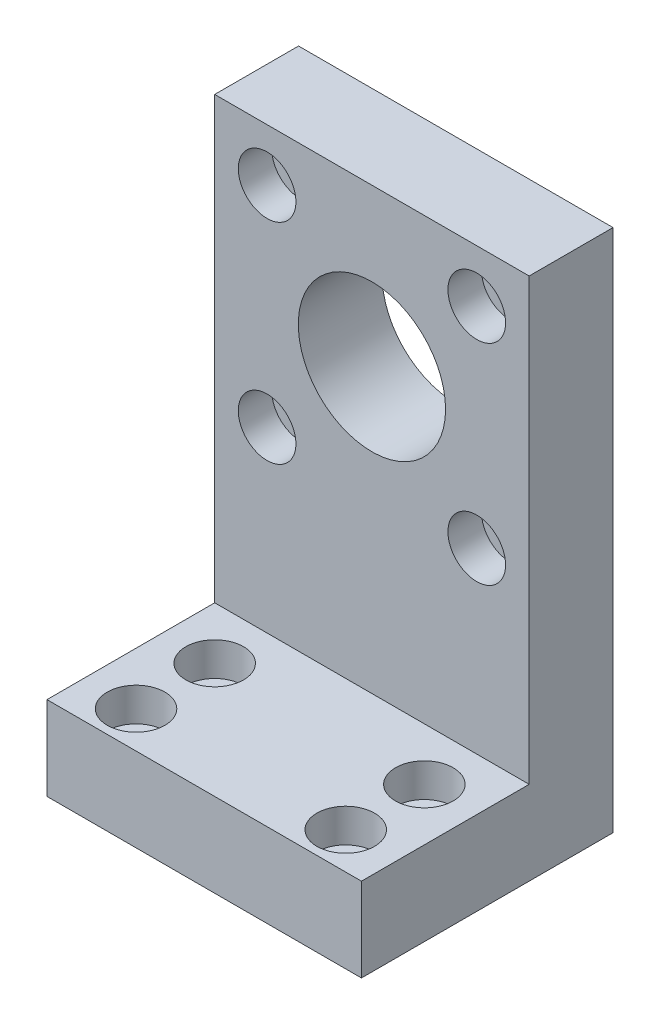
ISO-10303-21;
HEADER;
FILE_DESCRIPTION(('STEP AP214'),'2;1');
FILE_NAME('part.step','',(''),(''),'','','');
FILE_SCHEMA(('AUTOMOTIVE_DESIGN { 1 0 10303 214 1 1 1 1 }'));
ENDSEC;
DATA;
#1=APPLICATION_CONTEXT('core data for automotive mechanical design processes');
#2=APPLICATION_PROTOCOL_DEFINITION('international standard','automotive_design',2000,#1);
#3=PRODUCT_CONTEXT('',#1,'mechanical');
#4=PRODUCT('Part','Part','',(#3));
#5=PRODUCT_RELATED_PRODUCT_CATEGORY('part','',(#4));
#6=PRODUCT_DEFINITION_FORMATION('','',#4);
#7=PRODUCT_DEFINITION_CONTEXT('part definition',#1,'design');
#8=PRODUCT_DEFINITION('design','',#6,#7);
#9=PRODUCT_DEFINITION_SHAPE('','',#8);
#10=(LENGTH_UNIT() NAMED_UNIT(*) SI_UNIT(.MILLI.,.METRE.));
#11=(NAMED_UNIT(*) PLANE_ANGLE_UNIT() SI_UNIT($,.RADIAN.));
#12=(NAMED_UNIT(*) SI_UNIT($,.STERADIAN.) SOLID_ANGLE_UNIT());
#13=UNCERTAINTY_MEASURE_WITH_UNIT(LENGTH_MEASURE(1.E-05),#10,'distance_accuracy_value','');
#14=(GEOMETRIC_REPRESENTATION_CONTEXT(3) GLOBAL_UNCERTAINTY_ASSIGNED_CONTEXT((#13)) GLOBAL_UNIT_ASSIGNED_CONTEXT((#10,
#11,#12)) REPRESENTATION_CONTEXT('',''));
#15=CARTESIAN_POINT('',(0.,0.,0.));
#16=DIRECTION('',(0.,0.,1.));
#17=DIRECTION('',(1.,0.,0.));
#18=AXIS2_PLACEMENT_3D('',#15,#16,#17);
#19=CARTESIAN_POINT('',(0.,0.,8.));
#20=DIRECTION('',(0.,0.,-1.));
#21=DIRECTION('',(-1.,0.,0.));
#22=AXIS2_PLACEMENT_3D('',#19,#20,#21);
#23=PLANE('',#22);
#24=CARTESIAN_POINT('',(-20.,0.,8.));
#25=DIRECTION('',(0.,0.,1.));
#26=DIRECTION('',(1.,0.,0.));
#27=AXIS2_PLACEMENT_3D('',#24,#25,#26);
#28=CIRCLE('',#27,5.5);
#29=CARTESIAN_POINT('',(-14.5,0.,8.));
#30=VERTEX_POINT('',#29);
#31=EDGE_CURVE('E143',#30,#30,#28,.T.);
#32=ORIENTED_EDGE('',*,*,#31,.F.);
#33=EDGE_LOOP('',(#32));
#34=FACE_BOUND('',#33,.T.);
#35=CARTESIAN_POINT('',(20.,0.,8.));
#36=DIRECTION('',(0.,0.,1.));
#37=DIRECTION('',(1.,0.,0.));
#38=AXIS2_PLACEMENT_3D('',#35,#36,#37);
#39=CIRCLE('',#38,5.5);
#40=CARTESIAN_POINT('',(25.5,0.,8.));
#41=VERTEX_POINT('',#40);
#42=EDGE_CURVE('E159',#41,#41,#39,.T.);
#43=ORIENTED_EDGE('',*,*,#42,.F.);
#44=EDGE_LOOP('',(#43));
#45=FACE_BOUND('',#44,.T.);
#46=CARTESIAN_POINT('',(20.,40.,8.));
#47=DIRECTION('',(0.,0.,1.));
#48=DIRECTION('',(1.,0.,0.));
#49=AXIS2_PLACEMENT_3D('',#46,#47,#48);
#50=CIRCLE('',#49,5.5);
#51=CARTESIAN_POINT('',(25.5,40.,8.));
#52=VERTEX_POINT('',#51);
#53=EDGE_CURVE('E175',#52,#52,#50,.T.);
#54=ORIENTED_EDGE('',*,*,#53,.F.);
#55=EDGE_LOOP('',(#54));
#56=FACE_BOUND('',#55,.T.);
#57=CARTESIAN_POINT('',(-20.,40.,8.));
#58=DIRECTION('',(0.,0.,1.));
#59=DIRECTION('',(1.,0.,0.));
#60=AXIS2_PLACEMENT_3D('',#57,#58,#59);
#61=CIRCLE('',#60,5.5);
#62=CARTESIAN_POINT('',(-14.5,40.,8.));
#63=VERTEX_POINT('',#62);
#64=EDGE_CURVE('E191',#63,#63,#61,.T.);
#65=ORIENTED_EDGE('',*,*,#64,.F.);
#66=EDGE_LOOP('',(#65));
#67=FACE_BOUND('',#66,.T.);
#68=CARTESIAN_POINT('',(0.,20.,8.));
#69=DIRECTION('',(0.,0.,1.));
#70=DIRECTION('',(1.,0.,0.));
#71=AXIS2_PLACEMENT_3D('',#68,#69,#70);
#72=CIRCLE('',#71,14.05);
#73=CARTESIAN_POINT('',(14.05,20.,8.));
#74=VERTEX_POINT('',#73);
#75=EDGE_CURVE('E196',#74,#74,#72,.T.);
#76=ORIENTED_EDGE('',*,*,#75,.F.);
#77=EDGE_LOOP('',(#76));
#78=FACE_BOUND('',#77,.T.);
#79=DIRECTION('',(-1.,0.,0.));
#80=VECTOR('',#79,1.);
#81=CARTESIAN_POINT('',(-30.,-34.,8.));
#82=LINE('',#81,#80);
#83=CARTESIAN_POINT('',(30.,-34.,8.));
#84=VERTEX_POINT('',#83);
#85=CARTESIAN_POINT('',(-30.,-34.,8.));
#86=VERTEX_POINT('',#85);
#87=EDGE_CURVE('E61',#84,#86,#82,.T.);
#88=ORIENTED_EDGE('',*,*,#87,.F.);
#89=DIRECTION('',(0.,-1.,0.));
#90=VECTOR('',#89,1.);
#91=CARTESIAN_POINT('',(30.,50.,8.));
#92=LINE('',#91,#90);
#93=CARTESIAN_POINT('',(30.,50.,8.));
#94=VERTEX_POINT('',#93);
#95=EDGE_CURVE('E128',#94,#84,#92,.T.);
#96=ORIENTED_EDGE('',*,*,#95,.F.);
#97=DIRECTION('',(1.,0.,0.));
#98=VECTOR('',#97,1.);
#99=CARTESIAN_POINT('',(-30.,50.,8.));
#100=LINE('',#99,#98);
#101=CARTESIAN_POINT('',(-30.,50.,8.));
#102=VERTEX_POINT('',#101);
#103=EDGE_CURVE('E102',#102,#94,#100,.T.);
#104=ORIENTED_EDGE('',*,*,#103,.F.);
#105=DIRECTION('',(0.,-1.,0.));
#106=VECTOR('',#105,1.);
#107=CARTESIAN_POINT('',(-30.,50.,8.));
#108=LINE('',#107,#106);
#109=EDGE_CURVE('E91',#102,#86,#108,.T.);
#110=ORIENTED_EDGE('',*,*,#109,.T.);
#111=EDGE_LOOP('',(#88,#96,#104,#110));
#112=FACE_BOUND('',#111,.T.);
#113=ADVANCED_FACE('F43',(#34,#45,#56,#67,#78,#112),#23,.F.);
#114=CARTESIAN_POINT('',(-30.,50.,8.));
#115=DIRECTION('',(0.,1.,0.));
#116=DIRECTION('',(0.,0.,1.));
#117=AXIS2_PLACEMENT_3D('',#114,#115,#116);
#118=PLANE('',#117);
#119=DIRECTION('',(1.,0.,0.));
#120=VECTOR('',#119,1.);
#121=CARTESIAN_POINT('',(-30.,50.,-8.));
#122=LINE('',#121,#120);
#123=CARTESIAN_POINT('',(-30.,50.,-8.));
#124=VERTEX_POINT('',#123);
#125=CARTESIAN_POINT('',(30.,50.,-8.));
#126=VERTEX_POINT('',#125);
#127=EDGE_CURVE('E98',#124,#126,#122,.T.);
#128=ORIENTED_EDGE('',*,*,#127,.F.);
#129=DIRECTION('',(0.,0.,-1.));
#130=VECTOR('',#129,1.);
#131=CARTESIAN_POINT('',(-30.,50.,8.));
#132=LINE('',#131,#130);
#133=EDGE_CURVE('E11',#102,#124,#132,.T.);
#134=ORIENTED_EDGE('',*,*,#133,.F.);
#135=ORIENTED_EDGE('',*,*,#103,.T.);
#136=DIRECTION('',(0.,0.,-1.));
#137=VECTOR('',#136,1.);
#138=CARTESIAN_POINT('',(30.,50.,8.));
#139=LINE('',#138,#137);
#140=EDGE_CURVE('E47',#94,#126,#139,.T.);
#141=ORIENTED_EDGE('',*,*,#140,.T.);
#142=EDGE_LOOP('',(#128,#134,#135,#141));
#143=FACE_BOUND('',#142,.T.);
#144=ADVANCED_FACE('F45',(#143),#118,.T.);
#145=CARTESIAN_POINT('',(-30.,50.,8.));
#146=DIRECTION('',(1.,0.,0.));
#147=DIRECTION('',(0.,1.,0.));
#148=AXIS2_PLACEMENT_3D('',#145,#146,#147);
#149=PLANE('',#148);
#150=DIRECTION('',(0.,-1.,0.));
#151=VECTOR('',#150,1.);
#152=CARTESIAN_POINT('',(-30.,50.,-8.));
#153=LINE('',#152,#151);
#154=CARTESIAN_POINT('',(-30.,-50.,-8.));
#155=VERTEX_POINT('',#154);
#156=EDGE_CURVE('E88',#124,#155,#153,.T.);
#157=ORIENTED_EDGE('',*,*,#156,.T.);
#158=DIRECTION('',(0.,0.,-1.));
#159=VECTOR('',#158,1.);
#160=CARTESIAN_POINT('',(-30.,-50.,8.));
#161=LINE('',#160,#159);
#162=CARTESIAN_POINT('',(-30.,-50.,40.));
#163=VERTEX_POINT('',#162);
#164=EDGE_CURVE('E53',#163,#155,#161,.T.);
#165=ORIENTED_EDGE('',*,*,#164,.F.);
#166=DIRECTION('',(0.,-1.,0.));
#167=VECTOR('',#166,1.);
#168=CARTESIAN_POINT('',(-30.,-50.,40.));
#169=LINE('',#168,#167);
#170=CARTESIAN_POINT('',(-30.,-34.,40.));
#171=VERTEX_POINT('',#170);
#172=EDGE_CURVE('E212',#171,#163,#169,.T.);
#173=ORIENTED_EDGE('',*,*,#172,.F.);
#174=DIRECTION('',(0.,0.,-1.));
#175=VECTOR('',#174,1.);
#176=CARTESIAN_POINT('',(-30.,-34.,40.));
#177=LINE('',#176,#175);
#178=EDGE_CURVE('E206',#171,#86,#177,.T.);
#179=ORIENTED_EDGE('',*,*,#178,.T.);
#180=ORIENTED_EDGE('',*,*,#109,.F.);
#181=ORIENTED_EDGE('',*,*,#133,.T.);
#182=EDGE_LOOP('',(#157,#165,#173,#179,#180,#181));
#183=FACE_BOUND('',#182,.T.);
#184=ADVANCED_FACE('F86',(#183),#149,.F.);
#185=CARTESIAN_POINT('',(-30.,-50.,8.));
#186=DIRECTION('',(0.,1.,0.));
#187=DIRECTION('',(0.,0.,1.));
#188=AXIS2_PLACEMENT_3D('',#185,#186,#187);
#189=PLANE('',#188);
#190=CARTESIAN_POINT('',(-20.,-50.,18.));
#191=DIRECTION('',(0.,1.,0.));
#192=DIRECTION('',(0.,0.,1.));
#193=AXIS2_PLACEMENT_3D('',#190,#191,#192);
#194=CIRCLE('',#193,3.3);
#195=CARTESIAN_POINT('',(-20.,-50.,21.3));
#196=VERTEX_POINT('',#195);
#197=EDGE_CURVE('E275',#196,#196,#194,.T.);
#198=ORIENTED_EDGE('',*,*,#197,.T.);
#199=EDGE_LOOP('',(#198));
#200=FACE_BOUND('',#199,.T.);
#201=CARTESIAN_POINT('',(20.,-50.,18.));
#202=DIRECTION('',(0.,1.,0.));
#203=DIRECTION('',(0.,0.,1.));
#204=AXIS2_PLACEMENT_3D('',#201,#202,#203);
#205=CIRCLE('',#204,3.3);
#206=CARTESIAN_POINT('',(20.,-50.,21.3));
#207=VERTEX_POINT('',#206);
#208=EDGE_CURVE('E259',#207,#207,#205,.T.);
#209=ORIENTED_EDGE('',*,*,#208,.T.);
#210=EDGE_LOOP('',(#209));
#211=FACE_BOUND('',#210,.T.);
#212=CARTESIAN_POINT('',(20.,-50.,33.));
#213=DIRECTION('',(0.,1.,0.));
#214=DIRECTION('',(0.,0.,1.));
#215=AXIS2_PLACEMENT_3D('',#212,#213,#214);
#216=CIRCLE('',#215,3.3);
#217=CARTESIAN_POINT('',(20.,-50.,36.3));
#218=VERTEX_POINT('',#217);
#219=EDGE_CURVE('E243',#218,#218,#216,.T.);
#220=ORIENTED_EDGE('',*,*,#219,.T.);
#221=EDGE_LOOP('',(#220));
#222=FACE_BOUND('',#221,.T.);
#223=CARTESIAN_POINT('',(-20.,-50.,33.));
#224=DIRECTION('',(0.,1.,0.));
#225=DIRECTION('',(0.,0.,1.));
#226=AXIS2_PLACEMENT_3D('',#223,#224,#225);
#227=CIRCLE('',#226,3.3);
#228=CARTESIAN_POINT('',(-20.,-50.,36.3));
#229=VERTEX_POINT('',#228);
#230=EDGE_CURVE('E213',#229,#229,#227,.T.);
#231=ORIENTED_EDGE('',*,*,#230,.T.);
#232=EDGE_LOOP('',(#231));
#233=FACE_BOUND('',#232,.T.);
#234=DIRECTION('',(1.,0.,0.));
#235=VECTOR('',#234,1.);
#236=CARTESIAN_POINT('',(-30.,-50.,-8.));
#237=LINE('',#236,#235);
#238=CARTESIAN_POINT('',(30.,-50.,-8.));
#239=VERTEX_POINT('',#238);
#240=EDGE_CURVE('E100',#155,#239,#237,.T.);
#241=ORIENTED_EDGE('',*,*,#240,.T.);
#242=DIRECTION('',(0.,0.,-1.));
#243=VECTOR('',#242,1.);
#244=CARTESIAN_POINT('',(30.,-50.,8.));
#245=LINE('',#244,#243);
#246=CARTESIAN_POINT('',(30.,-50.,40.));
#247=VERTEX_POINT('',#246);
#248=EDGE_CURVE('E121',#247,#239,#245,.T.);
#249=ORIENTED_EDGE('',*,*,#248,.F.);
#250=DIRECTION('',(1.,0.,0.));
#251=VECTOR('',#250,1.);
#252=CARTESIAN_POINT('',(-30.,-50.,40.));
#253=LINE('',#252,#251);
#254=EDGE_CURVE('E221',#163,#247,#253,.T.);
#255=ORIENTED_EDGE('',*,*,#254,.F.);
#256=ORIENTED_EDGE('',*,*,#164,.T.);
#257=EDGE_LOOP('',(#241,#249,#255,#256));
#258=FACE_BOUND('',#257,.T.);
#259=ADVANCED_FACE('F320',(#200,#211,#222,#233,#258),#189,.F.);
#260=CARTESIAN_POINT('',(30.,50.,8.));
#261=DIRECTION('',(1.,0.,0.));
#262=DIRECTION('',(0.,1.,0.));
#263=AXIS2_PLACEMENT_3D('',#260,#261,#262);
#264=PLANE('',#263);
#265=DIRECTION('',(0.,-1.,0.));
#266=VECTOR('',#265,1.);
#267=CARTESIAN_POINT('',(30.,50.,-8.));
#268=LINE('',#267,#266);
#269=EDGE_CURVE('E106',#126,#239,#268,.T.);
#270=ORIENTED_EDGE('',*,*,#269,.F.);
#271=ORIENTED_EDGE('',*,*,#140,.F.);
#272=ORIENTED_EDGE('',*,*,#95,.T.);
#273=DIRECTION('',(0.,0.,-1.));
#274=VECTOR('',#273,1.);
#275=CARTESIAN_POINT('',(30.,-34.,40.));
#276=LINE('',#275,#274);
#277=CARTESIAN_POINT('',(30.,-34.,40.));
#278=VERTEX_POINT('',#277);
#279=EDGE_CURVE('E200',#278,#84,#276,.T.);
#280=ORIENTED_EDGE('',*,*,#279,.F.);
#281=DIRECTION('',(0.,1.,0.));
#282=VECTOR('',#281,1.);
#283=CARTESIAN_POINT('',(30.,-50.,40.));
#284=LINE('',#283,#282);
#285=EDGE_CURVE('E217',#247,#278,#284,.T.);
#286=ORIENTED_EDGE('',*,*,#285,.F.);
#287=ORIENTED_EDGE('',*,*,#248,.T.);
#288=EDGE_LOOP('',(#270,#271,#272,#280,#286,#287));
#289=FACE_BOUND('',#288,.T.);
#290=ADVANCED_FACE('F318',(#289),#264,.T.);
#291=CARTESIAN_POINT('',(0.,0.,-8.));
#292=DIRECTION('',(0.,0.,-1.));
#293=DIRECTION('',(-1.,0.,0.));
#294=AXIS2_PLACEMENT_3D('',#291,#292,#293);
#295=PLANE('',#294);
#296=CARTESIAN_POINT('',(0.,20.,-8.));
#297=DIRECTION('',(0.,0.,1.));
#298=DIRECTION('',(1.,0.,0.));
#299=AXIS2_PLACEMENT_3D('',#296,#297,#298);
#300=CIRCLE('',#299,14.05);
#301=CARTESIAN_POINT('',(14.05,20.,-8.));
#302=VERTEX_POINT('',#301);
#303=EDGE_CURVE('E195',#302,#302,#300,.T.);
#304=ORIENTED_EDGE('',*,*,#303,.T.);
#305=EDGE_LOOP('',(#304));
#306=FACE_BOUND('',#305,.T.);
#307=CARTESIAN_POINT('',(-20.,40.,-8.));
#308=DIRECTION('',(0.,0.,1.));
#309=DIRECTION('',(1.,0.,0.));
#310=AXIS2_PLACEMENT_3D('',#307,#308,#309);
#311=CIRCLE('',#310,3.3);
#312=CARTESIAN_POINT('',(-16.7,40.,-8.));
#313=VERTEX_POINT('',#312);
#314=EDGE_CURVE('E179',#313,#313,#311,.T.);
#315=ORIENTED_EDGE('',*,*,#314,.T.);
#316=EDGE_LOOP('',(#315));
#317=FACE_BOUND('',#316,.T.);
#318=CARTESIAN_POINT('',(20.,40.,-8.));
#319=DIRECTION('',(0.,0.,1.));
#320=DIRECTION('',(1.,0.,0.));
#321=AXIS2_PLACEMENT_3D('',#318,#319,#320);
#322=CIRCLE('',#321,3.3);
#323=CARTESIAN_POINT('',(23.3,40.,-8.));
#324=VERTEX_POINT('',#323);
#325=EDGE_CURVE('E163',#324,#324,#322,.T.);
#326=ORIENTED_EDGE('',*,*,#325,.T.);
#327=EDGE_LOOP('',(#326));
#328=FACE_BOUND('',#327,.T.);
#329=CARTESIAN_POINT('',(20.,0.,-8.));
#330=DIRECTION('',(0.,0.,1.));
#331=DIRECTION('',(1.,0.,0.));
#332=AXIS2_PLACEMENT_3D('',#329,#330,#331);
#333=CIRCLE('',#332,3.3);
#334=CARTESIAN_POINT('',(23.3,0.,-8.));
#335=VERTEX_POINT('',#334);
#336=EDGE_CURVE('E147',#335,#335,#333,.T.);
#337=ORIENTED_EDGE('',*,*,#336,.T.);
#338=EDGE_LOOP('',(#337));
#339=FACE_BOUND('',#338,.T.);
#340=CARTESIAN_POINT('',(-20.,0.,-8.));
#341=DIRECTION('',(0.,0.,1.));
#342=DIRECTION('',(1.,0.,0.));
#343=AXIS2_PLACEMENT_3D('',#340,#341,#342);
#344=CIRCLE('',#343,3.3);
#345=CARTESIAN_POINT('',(-16.7,0.,-8.));
#346=VERTEX_POINT('',#345);
#347=EDGE_CURVE('E107',#346,#346,#344,.T.);
#348=ORIENTED_EDGE('',*,*,#347,.T.);
#349=EDGE_LOOP('',(#348));
#350=FACE_BOUND('',#349,.T.);
#351=ORIENTED_EDGE('',*,*,#127,.T.);
#352=ORIENTED_EDGE('',*,*,#269,.T.);
#353=ORIENTED_EDGE('',*,*,#240,.F.);
#354=ORIENTED_EDGE('',*,*,#156,.F.);
#355=EDGE_LOOP('',(#351,#352,#353,#354));
#356=FACE_BOUND('',#355,.T.);
#357=ADVANCED_FACE('F96',(#306,#317,#328,#339,#350,#356),#295,.T.);
#358=CARTESIAN_POINT('',(-20.,0.,8.));
#359=DIRECTION('',(0.,0.,1.));
#360=DIRECTION('',(1.,0.,0.));
#361=AXIS2_PLACEMENT_3D('',#358,#359,#360);
#362=CYLINDRICAL_SURFACE('',#361,3.3);
#363=ORIENTED_EDGE('',*,*,#347,.F.);
#364=EDGE_LOOP('',(#363));
#365=FACE_BOUND('',#364,.T.);
#366=CARTESIAN_POINT('',(-20.,0.,1.6));
#367=DIRECTION('',(0.,0.,1.));
#368=DIRECTION('',(1.,0.,0.));
#369=AXIS2_PLACEMENT_3D('',#366,#367,#368);
#370=CIRCLE('',#369,3.3);
#371=CARTESIAN_POINT('',(-16.7,0.,1.6));
#372=VERTEX_POINT('',#371);
#373=EDGE_CURVE('E113',#372,#372,#370,.T.);
#374=ORIENTED_EDGE('',*,*,#373,.T.);
#375=EDGE_LOOP('',(#374));
#376=FACE_BOUND('',#375,.T.);
#377=ADVANCED_FACE('F325',(#365,#376),#362,.F.);
#378=CARTESIAN_POINT('',(-16.7,0.,1.6));
#379=DIRECTION('',(0.,0.,-1.));
#380=DIRECTION('',(-1.,0.,0.));
#381=AXIS2_PLACEMENT_3D('',#378,#379,#380);
#382=PLANE('',#381);
#383=ORIENTED_EDGE('',*,*,#373,.F.);
#384=EDGE_LOOP('',(#383));
#385=FACE_BOUND('',#384,.T.);
#386=CARTESIAN_POINT('',(-20.,0.,1.6));
#387=DIRECTION('',(0.,0.,1.));
#388=DIRECTION('',(1.,0.,0.));
#389=AXIS2_PLACEMENT_3D('',#386,#387,#388);
#390=CIRCLE('',#389,5.5);
#391=CARTESIAN_POINT('',(-14.5,0.,1.6));
#392=VERTEX_POINT('',#391);
#393=EDGE_CURVE('E139',#392,#392,#390,.T.);
#394=ORIENTED_EDGE('',*,*,#393,.T.);
#395=EDGE_LOOP('',(#394));
#396=FACE_BOUND('',#395,.T.);
#397=ADVANCED_FACE('F627',(#385,#396),#382,.F.);
#398=CARTESIAN_POINT('',(-20.,0.,8.));
#399=DIRECTION('',(0.,0.,1.));
#400=DIRECTION('',(1.,0.,0.));
#401=AXIS2_PLACEMENT_3D('',#398,#399,#400);
#402=CYLINDRICAL_SURFACE('',#401,5.5);
#403=ORIENTED_EDGE('',*,*,#393,.F.);
#404=EDGE_LOOP('',(#403));
#405=FACE_BOUND('',#404,.T.);
#406=ORIENTED_EDGE('',*,*,#31,.T.);
#407=EDGE_LOOP('',(#406));
#408=FACE_BOUND('',#407,.T.);
#409=ADVANCED_FACE('F617',(#405,#408),#402,.F.);
#410=CARTESIAN_POINT('',(20.,0.,8.));
#411=DIRECTION('',(0.,0.,1.));
#412=DIRECTION('',(1.,0.,0.));
#413=AXIS2_PLACEMENT_3D('',#410,#411,#412);
#414=CYLINDRICAL_SURFACE('',#413,3.3);
#415=ORIENTED_EDGE('',*,*,#336,.F.);
#416=EDGE_LOOP('',(#415));
#417=FACE_BOUND('',#416,.T.);
#418=CARTESIAN_POINT('',(20.,0.,1.6));
#419=DIRECTION('',(0.,0.,1.));
#420=DIRECTION('',(1.,0.,0.));
#421=AXIS2_PLACEMENT_3D('',#418,#419,#420);
#422=CIRCLE('',#421,3.3);
#423=CARTESIAN_POINT('',(23.3,0.,1.6));
#424=VERTEX_POINT('',#423);
#425=EDGE_CURVE('E151',#424,#424,#422,.T.);
#426=ORIENTED_EDGE('',*,*,#425,.T.);
#427=EDGE_LOOP('',(#426));
#428=FACE_BOUND('',#427,.T.);
#429=ADVANCED_FACE('F607',(#417,#428),#414,.F.);
#430=CARTESIAN_POINT('',(23.3,0.,1.6));
#431=DIRECTION('',(0.,0.,-1.));
#432=DIRECTION('',(-1.,0.,0.));
#433=AXIS2_PLACEMENT_3D('',#430,#431,#432);
#434=PLANE('',#433);
#435=ORIENTED_EDGE('',*,*,#425,.F.);
#436=EDGE_LOOP('',(#435));
#437=FACE_BOUND('',#436,.T.);
#438=CARTESIAN_POINT('',(20.,0.,1.6));
#439=DIRECTION('',(0.,0.,1.));
#440=DIRECTION('',(1.,0.,0.));
#441=AXIS2_PLACEMENT_3D('',#438,#439,#440);
#442=CIRCLE('',#441,5.5);
#443=CARTESIAN_POINT('',(25.5,0.,1.6));
#444=VERTEX_POINT('',#443);
#445=EDGE_CURVE('E155',#444,#444,#442,.T.);
#446=ORIENTED_EDGE('',*,*,#445,.T.);
#447=EDGE_LOOP('',(#446));
#448=FACE_BOUND('',#447,.T.);
#449=ADVANCED_FACE('F597',(#437,#448),#434,.F.);
#450=CARTESIAN_POINT('',(20.,0.,8.));
#451=DIRECTION('',(0.,0.,1.));
#452=DIRECTION('',(1.,0.,0.));
#453=AXIS2_PLACEMENT_3D('',#450,#451,#452);
#454=CYLINDRICAL_SURFACE('',#453,5.5);
#455=ORIENTED_EDGE('',*,*,#445,.F.);
#456=EDGE_LOOP('',(#455));
#457=FACE_BOUND('',#456,.T.);
#458=ORIENTED_EDGE('',*,*,#42,.T.);
#459=EDGE_LOOP('',(#458));
#460=FACE_BOUND('',#459,.T.);
#461=ADVANCED_FACE('F587',(#457,#460),#454,.F.);
#462=CARTESIAN_POINT('',(20.,40.,8.));
#463=DIRECTION('',(0.,0.,1.));
#464=DIRECTION('',(1.,0.,0.));
#465=AXIS2_PLACEMENT_3D('',#462,#463,#464);
#466=CYLINDRICAL_SURFACE('',#465,3.3);
#467=ORIENTED_EDGE('',*,*,#325,.F.);
#468=EDGE_LOOP('',(#467));
#469=FACE_BOUND('',#468,.T.);
#470=CARTESIAN_POINT('',(20.,40.,1.6));
#471=DIRECTION('',(0.,0.,1.));
#472=DIRECTION('',(1.,0.,0.));
#473=AXIS2_PLACEMENT_3D('',#470,#471,#472);
#474=CIRCLE('',#473,3.3);
#475=CARTESIAN_POINT('',(23.3,40.,1.6));
#476=VERTEX_POINT('',#475);
#477=EDGE_CURVE('E167',#476,#476,#474,.T.);
#478=ORIENTED_EDGE('',*,*,#477,.T.);
#479=EDGE_LOOP('',(#478));
#480=FACE_BOUND('',#479,.T.);
#481=ADVANCED_FACE('F577',(#469,#480),#466,.F.);
#482=CARTESIAN_POINT('',(23.3,40.,1.6));
#483=DIRECTION('',(0.,0.,-1.));
#484=DIRECTION('',(-1.,0.,0.));
#485=AXIS2_PLACEMENT_3D('',#482,#483,#484);
#486=PLANE('',#485);
#487=ORIENTED_EDGE('',*,*,#477,.F.);
#488=EDGE_LOOP('',(#487));
#489=FACE_BOUND('',#488,.T.);
#490=CARTESIAN_POINT('',(20.,40.,1.6));
#491=DIRECTION('',(0.,0.,1.));
#492=DIRECTION('',(1.,0.,0.));
#493=AXIS2_PLACEMENT_3D('',#490,#491,#492);
#494=CIRCLE('',#493,5.5);
#495=CARTESIAN_POINT('',(25.5,40.,1.6));
#496=VERTEX_POINT('',#495);
#497=EDGE_CURVE('E171',#496,#496,#494,.T.);
#498=ORIENTED_EDGE('',*,*,#497,.T.);
#499=EDGE_LOOP('',(#498));
#500=FACE_BOUND('',#499,.T.);
#501=ADVANCED_FACE('F567',(#489,#500),#486,.F.);
#502=CARTESIAN_POINT('',(20.,40.,8.));
#503=DIRECTION('',(0.,0.,1.));
#504=DIRECTION('',(1.,0.,0.));
#505=AXIS2_PLACEMENT_3D('',#502,#503,#504);
#506=CYLINDRICAL_SURFACE('',#505,5.5);
#507=ORIENTED_EDGE('',*,*,#497,.F.);
#508=EDGE_LOOP('',(#507));
#509=FACE_BOUND('',#508,.T.);
#510=ORIENTED_EDGE('',*,*,#53,.T.);
#511=EDGE_LOOP('',(#510));
#512=FACE_BOUND('',#511,.T.);
#513=ADVANCED_FACE('F557',(#509,#512),#506,.F.);
#514=CARTESIAN_POINT('',(-20.,40.,8.));
#515=DIRECTION('',(0.,0.,1.));
#516=DIRECTION('',(1.,0.,0.));
#517=AXIS2_PLACEMENT_3D('',#514,#515,#516);
#518=CYLINDRICAL_SURFACE('',#517,3.3);
#519=ORIENTED_EDGE('',*,*,#314,.F.);
#520=EDGE_LOOP('',(#519));
#521=FACE_BOUND('',#520,.T.);
#522=CARTESIAN_POINT('',(-20.,40.,1.6));
#523=DIRECTION('',(0.,0.,1.));
#524=DIRECTION('',(1.,0.,0.));
#525=AXIS2_PLACEMENT_3D('',#522,#523,#524);
#526=CIRCLE('',#525,3.3);
#527=CARTESIAN_POINT('',(-16.7,40.,1.6));
#528=VERTEX_POINT('',#527);
#529=EDGE_CURVE('E183',#528,#528,#526,.T.);
#530=ORIENTED_EDGE('',*,*,#529,.T.);
#531=EDGE_LOOP('',(#530));
#532=FACE_BOUND('',#531,.T.);
#533=ADVANCED_FACE('F547',(#521,#532),#518,.F.);
#534=CARTESIAN_POINT('',(-16.7,40.,1.6));
#535=DIRECTION('',(0.,0.,-1.));
#536=DIRECTION('',(-1.,0.,0.));
#537=AXIS2_PLACEMENT_3D('',#534,#535,#536);
#538=PLANE('',#537);
#539=ORIENTED_EDGE('',*,*,#529,.F.);
#540=EDGE_LOOP('',(#539));
#541=FACE_BOUND('',#540,.T.);
#542=CARTESIAN_POINT('',(-20.,40.,1.6));
#543=DIRECTION('',(0.,0.,1.));
#544=DIRECTION('',(1.,0.,0.));
#545=AXIS2_PLACEMENT_3D('',#542,#543,#544);
#546=CIRCLE('',#545,5.5);
#547=CARTESIAN_POINT('',(-14.5,40.,1.6));
#548=VERTEX_POINT('',#547);
#549=EDGE_CURVE('E187',#548,#548,#546,.T.);
#550=ORIENTED_EDGE('',*,*,#549,.T.);
#551=EDGE_LOOP('',(#550));
#552=FACE_BOUND('',#551,.T.);
#553=ADVANCED_FACE('F537',(#541,#552),#538,.F.);
#554=CARTESIAN_POINT('',(-20.,40.,8.));
#555=DIRECTION('',(0.,0.,1.));
#556=DIRECTION('',(1.,0.,0.));
#557=AXIS2_PLACEMENT_3D('',#554,#555,#556);
#558=CYLINDRICAL_SURFACE('',#557,5.5);
#559=ORIENTED_EDGE('',*,*,#549,.F.);
#560=EDGE_LOOP('',(#559));
#561=FACE_BOUND('',#560,.T.);
#562=ORIENTED_EDGE('',*,*,#64,.T.);
#563=EDGE_LOOP('',(#562));
#564=FACE_BOUND('',#563,.T.);
#565=ADVANCED_FACE('F528',(#561,#564),#558,.F.);
#566=CARTESIAN_POINT('',(0.,20.,-8.));
#567=DIRECTION('',(0.,0.,1.));
#568=DIRECTION('',(1.,0.,0.));
#569=AXIS2_PLACEMENT_3D('',#566,#567,#568);
#570=CYLINDRICAL_SURFACE('',#569,14.05);
#571=ORIENTED_EDGE('',*,*,#303,.F.);
#572=EDGE_LOOP('',(#571));
#573=FACE_BOUND('',#572,.T.);
#574=ORIENTED_EDGE('',*,*,#75,.T.);
#575=EDGE_LOOP('',(#574));
#576=FACE_BOUND('',#575,.T.);
#577=ADVANCED_FACE('F298',(#573,#576),#570,.F.);
#578=CARTESIAN_POINT('',(-30.,-34.,40.));
#579=DIRECTION('',(0.,-1.,0.));
#580=DIRECTION('',(0.,0.,-1.));
#581=AXIS2_PLACEMENT_3D('',#578,#579,#580);
#582=PLANE('',#581);
#583=CARTESIAN_POINT('',(-20.,-34.,18.));
#584=DIRECTION('',(0.,1.,0.));
#585=DIRECTION('',(0.,0.,1.));
#586=AXIS2_PLACEMENT_3D('',#583,#584,#585);
#587=CIRCLE('',#586,5.49999999999999);
#588=CARTESIAN_POINT('',(-20.,-34.,23.5));
#589=VERTEX_POINT('',#588);
#590=EDGE_CURVE('E287',#589,#589,#587,.T.);
#591=ORIENTED_EDGE('',*,*,#590,.F.);
#592=EDGE_LOOP('',(#591));
#593=FACE_BOUND('',#592,.T.);
#594=CARTESIAN_POINT('',(20.,-34.,18.));
#595=DIRECTION('',(0.,1.,0.));
#596=DIRECTION('',(0.,0.,1.));
#597=AXIS2_PLACEMENT_3D('',#594,#595,#596);
#598=CIRCLE('',#597,5.49999999999999);
#599=CARTESIAN_POINT('',(20.,-34.,23.5));
#600=VERTEX_POINT('',#599);
#601=EDGE_CURVE('E271',#600,#600,#598,.T.);
#602=ORIENTED_EDGE('',*,*,#601,.F.);
#603=EDGE_LOOP('',(#602));
#604=FACE_BOUND('',#603,.T.);
#605=CARTESIAN_POINT('',(20.,-34.,33.));
#606=DIRECTION('',(0.,1.,0.));
#607=DIRECTION('',(0.,0.,1.));
#608=AXIS2_PLACEMENT_3D('',#605,#606,#607);
#609=CIRCLE('',#608,5.49999999999999);
#610=CARTESIAN_POINT('',(20.,-34.,38.5));
#611=VERTEX_POINT('',#610);
#612=EDGE_CURVE('E255',#611,#611,#609,.T.);
#613=ORIENTED_EDGE('',*,*,#612,.F.);
#614=EDGE_LOOP('',(#613));
#615=FACE_BOUND('',#614,.T.);
#616=CARTESIAN_POINT('',(-20.,-34.,33.));
#617=DIRECTION('',(0.,1.,0.));
#618=DIRECTION('',(0.,0.,1.));
#619=AXIS2_PLACEMENT_3D('',#616,#617,#618);
#620=CIRCLE('',#619,5.49999999999999);
#621=CARTESIAN_POINT('',(-20.,-34.,38.5));
#622=VERTEX_POINT('',#621);
#623=EDGE_CURVE('E239',#622,#622,#620,.T.);
#624=ORIENTED_EDGE('',*,*,#623,.F.);
#625=EDGE_LOOP('',(#624));
#626=FACE_BOUND('',#625,.T.);
#627=ORIENTED_EDGE('',*,*,#87,.T.);
#628=ORIENTED_EDGE('',*,*,#178,.F.);
#629=DIRECTION('',(-1.,0.,0.));
#630=VECTOR('',#629,1.);
#631=CARTESIAN_POINT('',(-30.,-34.,40.));
#632=LINE('',#631,#630);
#633=EDGE_CURVE('E209',#278,#171,#632,.T.);
#634=ORIENTED_EDGE('',*,*,#633,.F.);
#635=ORIENTED_EDGE('',*,*,#279,.T.);
#636=EDGE_LOOP('',(#627,#628,#634,#635));
#637=FACE_BOUND('',#636,.T.);
#638=ADVANCED_FACE('F294',(#593,#604,#615,#626,#637),#582,.F.);
#639=CARTESIAN_POINT('',(0.,0.,40.));
#640=DIRECTION('',(0.,0.,-1.));
#641=DIRECTION('',(-1.,0.,0.));
#642=AXIS2_PLACEMENT_3D('',#639,#640,#641);
#643=PLANE('',#642);
#644=ORIENTED_EDGE('',*,*,#172,.T.);
#645=ORIENTED_EDGE('',*,*,#254,.T.);
#646=ORIENTED_EDGE('',*,*,#285,.T.);
#647=ORIENTED_EDGE('',*,*,#633,.T.);
#648=EDGE_LOOP('',(#644,#645,#646,#647));
#649=FACE_BOUND('',#648,.T.);
#650=ADVANCED_FACE('F297',(#649),#643,.F.);
#651=CARTESIAN_POINT('',(-20.,-34.,33.));
#652=DIRECTION('',(0.,1.,0.));
#653=DIRECTION('',(0.,0.,1.));
#654=AXIS2_PLACEMENT_3D('',#651,#652,#653);
#655=CYLINDRICAL_SURFACE('',#654,3.3);
#656=ORIENTED_EDGE('',*,*,#230,.F.);
#657=EDGE_LOOP('',(#656));
#658=FACE_BOUND('',#657,.T.);
#659=CARTESIAN_POINT('',(-20.,-40.4,33.));
#660=DIRECTION('',(0.,1.,0.));
#661=DIRECTION('',(0.,0.,1.));
#662=AXIS2_PLACEMENT_3D('',#659,#660,#661);
#663=CIRCLE('',#662,3.30000000000001);
#664=CARTESIAN_POINT('',(-20.,-40.4,36.3));
#665=VERTEX_POINT('',#664);
#666=EDGE_CURVE('E231',#665,#665,#663,.T.);
#667=ORIENTED_EDGE('',*,*,#666,.T.);
#668=EDGE_LOOP('',(#667));
#669=FACE_BOUND('',#668,.T.);
#670=ADVANCED_FACE('F369',(#658,#669),#655,.F.);
#671=CARTESIAN_POINT('',(-16.7,-40.4,33.));
#672=DIRECTION('',(0.,-1.,0.));
#673=DIRECTION('',(0.,0.,-1.));
#674=AXIS2_PLACEMENT_3D('',#671,#672,#673);
#675=PLANE('',#674);
#676=ORIENTED_EDGE('',*,*,#666,.F.);
#677=EDGE_LOOP('',(#676));
#678=FACE_BOUND('',#677,.T.);
#679=CARTESIAN_POINT('',(-20.,-40.4,33.));
#680=DIRECTION('',(0.,1.,0.));
#681=DIRECTION('',(0.,0.,1.));
#682=AXIS2_PLACEMENT_3D('',#679,#680,#681);
#683=CIRCLE('',#682,5.49999999999999);
#684=CARTESIAN_POINT('',(-20.,-40.4,38.5));
#685=VERTEX_POINT('',#684);
#686=EDGE_CURVE('E235',#685,#685,#683,.T.);
#687=ORIENTED_EDGE('',*,*,#686,.T.);
#688=EDGE_LOOP('',(#687));
#689=FACE_BOUND('',#688,.T.);
#690=ADVANCED_FACE('F374',(#678,#689),#675,.F.);
#691=CARTESIAN_POINT('',(-20.,-34.,33.));
#692=DIRECTION('',(0.,1.,0.));
#693=DIRECTION('',(0.,0.,1.));
#694=AXIS2_PLACEMENT_3D('',#691,#692,#693);
#695=CYLINDRICAL_SURFACE('',#694,5.49999999999999);
#696=ORIENTED_EDGE('',*,*,#686,.F.);
#697=EDGE_LOOP('',(#696));
#698=FACE_BOUND('',#697,.T.);
#699=ORIENTED_EDGE('',*,*,#623,.T.);
#700=EDGE_LOOP('',(#699));
#701=FACE_BOUND('',#700,.T.);
#702=ADVANCED_FACE('F385',(#698,#701),#695,.F.);
#703=CARTESIAN_POINT('',(20.,-34.,33.));
#704=DIRECTION('',(0.,1.,0.));
#705=DIRECTION('',(0.,0.,1.));
#706=AXIS2_PLACEMENT_3D('',#703,#704,#705);
#707=CYLINDRICAL_SURFACE('',#706,3.3);
#708=ORIENTED_EDGE('',*,*,#219,.F.);
#709=EDGE_LOOP('',(#708));
#710=FACE_BOUND('',#709,.T.);
#711=CARTESIAN_POINT('',(20.,-40.4,33.));
#712=DIRECTION('',(0.,1.,0.));
#713=DIRECTION('',(0.,0.,1.));
#714=AXIS2_PLACEMENT_3D('',#711,#712,#713);
#715=CIRCLE('',#714,3.30000000000001);
#716=CARTESIAN_POINT('',(20.,-40.4,36.3));
#717=VERTEX_POINT('',#716);
#718=EDGE_CURVE('E247',#717,#717,#715,.T.);
#719=ORIENTED_EDGE('',*,*,#718,.T.);
#720=EDGE_LOOP('',(#719));
#721=FACE_BOUND('',#720,.T.);
#722=ADVANCED_FACE('F396',(#710,#721),#707,.F.);
#723=CARTESIAN_POINT('',(23.3,-40.4,33.));
#724=DIRECTION('',(0.,-1.,0.));
#725=DIRECTION('',(0.,0.,-1.));
#726=AXIS2_PLACEMENT_3D('',#723,#724,#725);
#727=PLANE('',#726);
#728=ORIENTED_EDGE('',*,*,#718,.F.);
#729=EDGE_LOOP('',(#728));
#730=FACE_BOUND('',#729,.T.);
#731=CARTESIAN_POINT('',(20.,-40.4,33.));
#732=DIRECTION('',(0.,1.,0.));
#733=DIRECTION('',(0.,0.,1.));
#734=AXIS2_PLACEMENT_3D('',#731,#732,#733);
#735=CIRCLE('',#734,5.49999999999999);
#736=CARTESIAN_POINT('',(20.,-40.4,38.5));
#737=VERTEX_POINT('',#736);
#738=EDGE_CURVE('E251',#737,#737,#735,.T.);
#739=ORIENTED_EDGE('',*,*,#738,.T.);
#740=EDGE_LOOP('',(#739));
#741=FACE_BOUND('',#740,.T.);
#742=ADVANCED_FACE('F407',(#730,#741),#727,.F.);
#743=CARTESIAN_POINT('',(20.,-34.,33.));
#744=DIRECTION('',(0.,1.,0.));
#745=DIRECTION('',(0.,0.,1.));
#746=AXIS2_PLACEMENT_3D('',#743,#744,#745);
#747=CYLINDRICAL_SURFACE('',#746,5.49999999999999);
#748=ORIENTED_EDGE('',*,*,#738,.F.);
#749=EDGE_LOOP('',(#748));
#750=FACE_BOUND('',#749,.T.);
#751=ORIENTED_EDGE('',*,*,#612,.T.);
#752=EDGE_LOOP('',(#751));
#753=FACE_BOUND('',#752,.T.);
#754=ADVANCED_FACE('F418',(#750,#753),#747,.F.);
#755=CARTESIAN_POINT('',(20.,-34.,18.));
#756=DIRECTION('',(0.,1.,0.));
#757=DIRECTION('',(0.,0.,1.));
#758=AXIS2_PLACEMENT_3D('',#755,#756,#757);
#759=CYLINDRICAL_SURFACE('',#758,3.3);
#760=ORIENTED_EDGE('',*,*,#208,.F.);
#761=EDGE_LOOP('',(#760));
#762=FACE_BOUND('',#761,.T.);
#763=CARTESIAN_POINT('',(20.,-40.4,18.));
#764=DIRECTION('',(0.,1.,0.));
#765=DIRECTION('',(0.,0.,1.));
#766=AXIS2_PLACEMENT_3D('',#763,#764,#765);
#767=CIRCLE('',#766,3.30000000000001);
#768=CARTESIAN_POINT('',(20.,-40.4,21.3));
#769=VERTEX_POINT('',#768);
#770=EDGE_CURVE('E263',#769,#769,#767,.T.);
#771=ORIENTED_EDGE('',*,*,#770,.T.);
#772=EDGE_LOOP('',(#771));
#773=FACE_BOUND('',#772,.T.);
#774=ADVANCED_FACE('F429',(#762,#773),#759,.F.);
#775=CARTESIAN_POINT('',(23.3,-40.4,18.));
#776=DIRECTION('',(0.,-1.,0.));
#777=DIRECTION('',(0.,0.,-1.));
#778=AXIS2_PLACEMENT_3D('',#775,#776,#777);
#779=PLANE('',#778);
#780=ORIENTED_EDGE('',*,*,#770,.F.);
#781=EDGE_LOOP('',(#780));
#782=FACE_BOUND('',#781,.T.);
#783=CARTESIAN_POINT('',(20.,-40.4,18.));
#784=DIRECTION('',(0.,1.,0.));
#785=DIRECTION('',(0.,0.,1.));
#786=AXIS2_PLACEMENT_3D('',#783,#784,#785);
#787=CIRCLE('',#786,5.49999999999999);
#788=CARTESIAN_POINT('',(20.,-40.4,23.5));
#789=VERTEX_POINT('',#788);
#790=EDGE_CURVE('E267',#789,#789,#787,.T.);
#791=ORIENTED_EDGE('',*,*,#790,.T.);
#792=EDGE_LOOP('',(#791));
#793=FACE_BOUND('',#792,.T.);
#794=ADVANCED_FACE('F440',(#782,#793),#779,.F.);
#795=CARTESIAN_POINT('',(20.,-34.,18.));
#796=DIRECTION('',(0.,1.,0.));
#797=DIRECTION('',(0.,0.,1.));
#798=AXIS2_PLACEMENT_3D('',#795,#796,#797);
#799=CYLINDRICAL_SURFACE('',#798,5.49999999999999);
#800=ORIENTED_EDGE('',*,*,#790,.F.);
#801=EDGE_LOOP('',(#800));
#802=FACE_BOUND('',#801,.T.);
#803=ORIENTED_EDGE('',*,*,#601,.T.);
#804=EDGE_LOOP('',(#803));
#805=FACE_BOUND('',#804,.T.);
#806=ADVANCED_FACE('F451',(#802,#805),#799,.F.);
#807=CARTESIAN_POINT('',(-20.,-34.,18.));
#808=DIRECTION('',(0.,1.,0.));
#809=DIRECTION('',(0.,0.,1.));
#810=AXIS2_PLACEMENT_3D('',#807,#808,#809);
#811=CYLINDRICAL_SURFACE('',#810,3.3);
#812=ORIENTED_EDGE('',*,*,#197,.F.);
#813=EDGE_LOOP('',(#812));
#814=FACE_BOUND('',#813,.T.);
#815=CARTESIAN_POINT('',(-20.,-40.4,18.));
#816=DIRECTION('',(0.,1.,0.));
#817=DIRECTION('',(0.,0.,1.));
#818=AXIS2_PLACEMENT_3D('',#815,#816,#817);
#819=CIRCLE('',#818,3.30000000000001);
#820=CARTESIAN_POINT('',(-20.,-40.4,21.3));
#821=VERTEX_POINT('',#820);
#822=EDGE_CURVE('E279',#821,#821,#819,.T.);
#823=ORIENTED_EDGE('',*,*,#822,.T.);
#824=EDGE_LOOP('',(#823));
#825=FACE_BOUND('',#824,.T.);
#826=ADVANCED_FACE('F462',(#814,#825),#811,.F.);
#827=CARTESIAN_POINT('',(-16.7,-40.4,18.));
#828=DIRECTION('',(0.,-1.,0.));
#829=DIRECTION('',(0.,0.,-1.));
#830=AXIS2_PLACEMENT_3D('',#827,#828,#829);
#831=PLANE('',#830);
#832=ORIENTED_EDGE('',*,*,#822,.F.);
#833=EDGE_LOOP('',(#832));
#834=FACE_BOUND('',#833,.T.);
#835=CARTESIAN_POINT('',(-20.,-40.4,18.));
#836=DIRECTION('',(0.,1.,0.));
#837=DIRECTION('',(0.,0.,1.));
#838=AXIS2_PLACEMENT_3D('',#835,#836,#837);
#839=CIRCLE('',#838,5.49999999999999);
#840=CARTESIAN_POINT('',(-20.,-40.4,23.5));
#841=VERTEX_POINT('',#840);
#842=EDGE_CURVE('E283',#841,#841,#839,.T.);
#843=ORIENTED_EDGE('',*,*,#842,.T.);
#844=EDGE_LOOP('',(#843));
#845=FACE_BOUND('',#844,.T.);
#846=ADVANCED_FACE('F473',(#834,#845),#831,.F.);
#847=CARTESIAN_POINT('',(-20.,-34.,18.));
#848=DIRECTION('',(0.,1.,0.));
#849=DIRECTION('',(0.,0.,1.));
#850=AXIS2_PLACEMENT_3D('',#847,#848,#849);
#851=CYLINDRICAL_SURFACE('',#850,5.49999999999999);
#852=ORIENTED_EDGE('',*,*,#842,.F.);
#853=EDGE_LOOP('',(#852));
#854=FACE_BOUND('',#853,.T.);
#855=ORIENTED_EDGE('',*,*,#590,.T.);
#856=EDGE_LOOP('',(#855));
#857=FACE_BOUND('',#856,.T.);
#858=ADVANCED_FACE('F292',(#854,#857),#851,.F.);
#859=CLOSED_SHELL('',(#113,#144,#184,#259,#290,#357,#377,#397,#409,#429,#449,#461,#481,#501,
#513,#533,#553,#565,#577,#638,#650,#670,#690,#702,#722,#742,#754,#774,#794,#806,#826,#846,#858));
#860=MANIFOLD_SOLID_BREP('B2',#859);
#861=ADVANCED_BREP_SHAPE_REPRESENTATION('',(#18,#860),#14);
#862=SHAPE_DEFINITION_REPRESENTATION(#9,#861);
ENDSEC;
END-ISO-10303-21;
